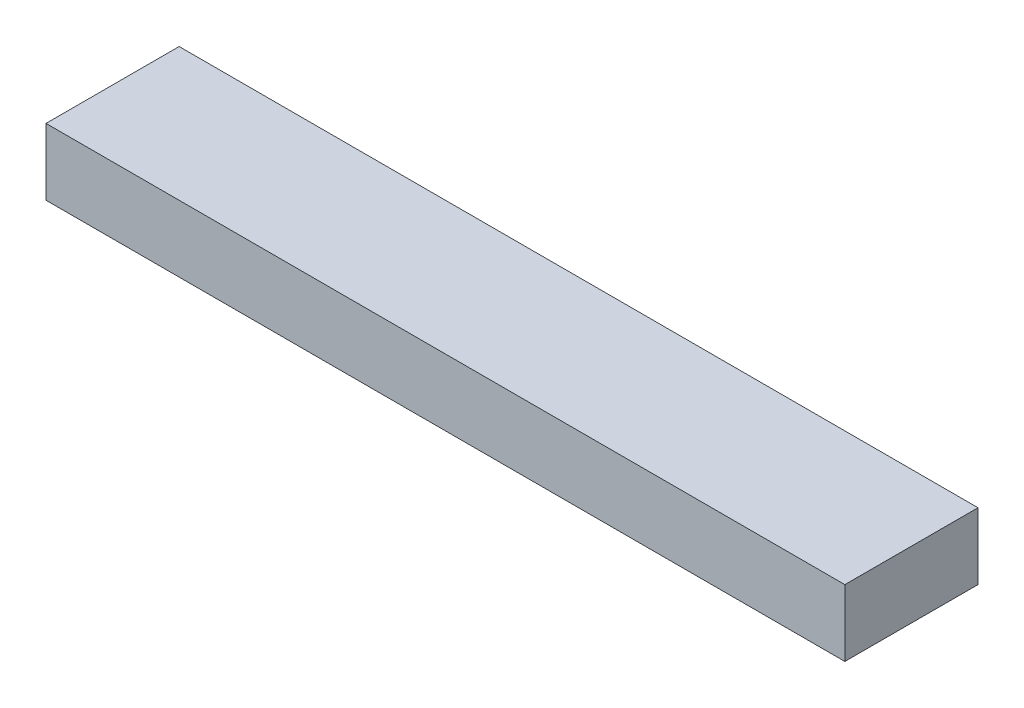
ISO-10303-21;
HEADER;
FILE_DESCRIPTION(('STEP AP214'),'2;1');
FILE_NAME('part.step','',(''),(''),'','','');
FILE_SCHEMA(('AUTOMOTIVE_DESIGN { 1 0 10303 214 1 1 1 1 }'));
ENDSEC;
DATA;
#1=APPLICATION_CONTEXT('core data for automotive mechanical design processes');
#2=APPLICATION_PROTOCOL_DEFINITION('international standard','automotive_design',2000,#1);
#3=PRODUCT_CONTEXT('',#1,'mechanical');
#4=PRODUCT('Part','Part','',(#3));
#5=PRODUCT_RELATED_PRODUCT_CATEGORY('part','',(#4));
#6=PRODUCT_DEFINITION_FORMATION('','',#4);
#7=PRODUCT_DEFINITION_CONTEXT('part definition',#1,'design');
#8=PRODUCT_DEFINITION('design','',#6,#7);
#9=PRODUCT_DEFINITION_SHAPE('','',#8);
#10=(LENGTH_UNIT() NAMED_UNIT(*) SI_UNIT(.MILLI.,.METRE.));
#11=(NAMED_UNIT(*) PLANE_ANGLE_UNIT() SI_UNIT($,.RADIAN.));
#12=(NAMED_UNIT(*) SI_UNIT($,.STERADIAN.) SOLID_ANGLE_UNIT());
#13=UNCERTAINTY_MEASURE_WITH_UNIT(LENGTH_MEASURE(1.E-05),#10,'distance_accuracy_value','');
#14=(GEOMETRIC_REPRESENTATION_CONTEXT(3) GLOBAL_UNCERTAINTY_ASSIGNED_CONTEXT((#13)) GLOBAL_UNIT_ASSIGNED_CONTEXT((#10,
#11,#12)) REPRESENTATION_CONTEXT('',''));
#15=CARTESIAN_POINT('',(0.,0.,0.));
#16=DIRECTION('',(0.,0.,1.));
#17=DIRECTION('',(1.,0.,0.));
#18=AXIS2_PLACEMENT_3D('',#15,#16,#17);
#19=CARTESIAN_POINT('',(0.,3.175,0.));
#20=DIRECTION('',(1.,0.,0.));
#21=DIRECTION('',(0.,0.,-1.));
#22=AXIS2_PLACEMENT_3D('',#19,#20,#21);
#23=PLANE('',#22);
#24=DIRECTION('',(0.,0.,1.));
#25=VECTOR('',#24,1.);
#26=CARTESIAN_POINT('',(0.,0.,0.));
#27=LINE('',#26,#25);
#28=CARTESIAN_POINT('',(0.,0.,-6.35));
#29=VERTEX_POINT('',#28);
#30=CARTESIAN_POINT('',(0.,0.,0.));
#31=VERTEX_POINT('',#30);
#32=EDGE_CURVE('E103',#29,#31,#27,.T.);
#33=ORIENTED_EDGE('',*,*,#32,.T.);
#34=DIRECTION('',(0.,-1.,0.));
#35=VECTOR('',#34,1.);
#36=CARTESIAN_POINT('',(0.,3.175,0.));
#37=LINE('',#36,#35);
#38=CARTESIAN_POINT('',(0.,3.175,0.));
#39=VERTEX_POINT('',#38);
#40=EDGE_CURVE('E11',#39,#31,#37,.T.);
#41=ORIENTED_EDGE('',*,*,#40,.F.);
#42=DIRECTION('',(0.,0.,1.));
#43=VECTOR('',#42,1.);
#44=CARTESIAN_POINT('',(0.,3.175,0.));
#45=LINE('',#44,#43);
#46=CARTESIAN_POINT('',(0.,3.175,-6.35));
#47=VERTEX_POINT('',#46);
#48=EDGE_CURVE('E91',#47,#39,#45,.T.);
#49=ORIENTED_EDGE('',*,*,#48,.F.);
#50=DIRECTION('',(0.,-1.,0.));
#51=VECTOR('',#50,1.);
#52=CARTESIAN_POINT('',(0.,3.175,-6.35));
#53=LINE('',#52,#51);
#54=EDGE_CURVE('E99',#47,#29,#53,.T.);
#55=ORIENTED_EDGE('',*,*,#54,.T.);
#56=EDGE_LOOP('',(#33,#41,#49,#55));
#57=FACE_BOUND('',#56,.T.);
#58=ADVANCED_FACE('F40',(#57),#23,.F.);
#59=CARTESIAN_POINT('',(0.,3.175,0.));
#60=DIRECTION('',(0.,0.,-1.));
#61=DIRECTION('',(-1.,0.,0.));
#62=AXIS2_PLACEMENT_3D('',#59,#60,#61);
#63=PLANE('',#62);
#64=DIRECTION('',(1.,0.,0.));
#65=VECTOR('',#64,1.);
#66=CARTESIAN_POINT('',(0.,0.,0.));
#67=LINE('',#66,#65);
#68=CARTESIAN_POINT('',(38.1,0.,0.));
#69=VERTEX_POINT('',#68);
#70=EDGE_CURVE('E95',#31,#69,#67,.T.);
#71=ORIENTED_EDGE('',*,*,#70,.T.);
#72=DIRECTION('',(0.,-1.,0.));
#73=VECTOR('',#72,1.);
#74=CARTESIAN_POINT('',(38.1,3.175,0.));
#75=LINE('',#74,#73);
#76=CARTESIAN_POINT('',(38.1,3.175,0.));
#77=VERTEX_POINT('',#76);
#78=EDGE_CURVE('E48',#77,#69,#75,.T.);
#79=ORIENTED_EDGE('',*,*,#78,.F.);
#80=DIRECTION('',(1.,0.,0.));
#81=VECTOR('',#80,1.);
#82=CARTESIAN_POINT('',(0.,3.175,0.));
#83=LINE('',#82,#81);
#84=EDGE_CURVE('E86',#39,#77,#83,.T.);
#85=ORIENTED_EDGE('',*,*,#84,.F.);
#86=ORIENTED_EDGE('',*,*,#40,.T.);
#87=EDGE_LOOP('',(#71,#79,#85,#86));
#88=FACE_BOUND('',#87,.T.);
#89=ADVANCED_FACE('F94',(#88),#63,.F.);
#90=CARTESIAN_POINT('',(38.1,3.175,0.));
#91=DIRECTION('',(-1.,0.,0.));
#92=DIRECTION('',(0.,0.,1.));
#93=AXIS2_PLACEMENT_3D('',#90,#91,#92);
#94=PLANE('',#93);
#95=DIRECTION('',(0.,0.,-1.));
#96=VECTOR('',#95,1.);
#97=CARTESIAN_POINT('',(38.1,0.,0.));
#98=LINE('',#97,#96);
#99=CARTESIAN_POINT('',(38.1,0.,-6.35));
#100=VERTEX_POINT('',#99);
#101=EDGE_CURVE('E73',#69,#100,#98,.T.);
#102=ORIENTED_EDGE('',*,*,#101,.T.);
#103=DIRECTION('',(0.,-1.,0.));
#104=VECTOR('',#103,1.);
#105=CARTESIAN_POINT('',(38.1,3.175,-6.35));
#106=LINE('',#105,#104);
#107=CARTESIAN_POINT('',(38.1,3.175,-6.35));
#108=VERTEX_POINT('',#107);
#109=EDGE_CURVE('E96',#108,#100,#106,.T.);
#110=ORIENTED_EDGE('',*,*,#109,.F.);
#111=DIRECTION('',(0.,0.,-1.));
#112=VECTOR('',#111,1.);
#113=CARTESIAN_POINT('',(38.1,3.175,0.));
#114=LINE('',#113,#112);
#115=EDGE_CURVE('E89',#77,#108,#114,.T.);
#116=ORIENTED_EDGE('',*,*,#115,.F.);
#117=ORIENTED_EDGE('',*,*,#78,.T.);
#118=EDGE_LOOP('',(#102,#110,#116,#117));
#119=FACE_BOUND('',#118,.T.);
#120=ADVANCED_FACE('F97',(#119),#94,.F.);
#121=CARTESIAN_POINT('',(0.,3.175,-6.35));
#122=DIRECTION('',(0.,0.,1.));
#123=DIRECTION('',(1.,0.,0.));
#124=AXIS2_PLACEMENT_3D('',#121,#122,#123);
#125=PLANE('',#124);
#126=DIRECTION('',(-1.,0.,0.));
#127=VECTOR('',#126,1.);
#128=CARTESIAN_POINT('',(0.,0.,-6.35));
#129=LINE('',#128,#127);
#130=EDGE_CURVE('E79',#100,#29,#129,.T.);
#131=ORIENTED_EDGE('',*,*,#130,.T.);
#132=ORIENTED_EDGE('',*,*,#54,.F.);
#133=DIRECTION('',(-1.,0.,0.));
#134=VECTOR('',#133,1.);
#135=CARTESIAN_POINT('',(0.,3.175,-6.35));
#136=LINE('',#135,#134);
#137=EDGE_CURVE('E56',#108,#47,#136,.T.);
#138=ORIENTED_EDGE('',*,*,#137,.F.);
#139=ORIENTED_EDGE('',*,*,#109,.T.);
#140=EDGE_LOOP('',(#131,#132,#138,#139));
#141=FACE_BOUND('',#140,.T.);
#142=ADVANCED_FACE('F110',(#141),#125,.F.);
#143=CARTESIAN_POINT('',(0.,3.175,0.));
#144=DIRECTION('',(0.,-1.,0.));
#145=DIRECTION('',(0.,0.,-1.));
#146=AXIS2_PLACEMENT_3D('',#143,#144,#145);
#147=PLANE('',#146);
#148=ORIENTED_EDGE('',*,*,#48,.T.);
#149=ORIENTED_EDGE('',*,*,#84,.T.);
#150=ORIENTED_EDGE('',*,*,#115,.T.);
#151=ORIENTED_EDGE('',*,*,#137,.T.);
#152=EDGE_LOOP('',(#148,#149,#150,#151));
#153=FACE_BOUND('',#152,.T.);
#154=ADVANCED_FACE('F87',(#153),#147,.F.);
#155=CARTESIAN_POINT('',(0.,0.,0.));
#156=DIRECTION('',(0.,-1.,0.));
#157=DIRECTION('',(0.,0.,-1.));
#158=AXIS2_PLACEMENT_3D('',#155,#156,#157);
#159=PLANE('',#158);
#160=ORIENTED_EDGE('',*,*,#32,.F.);
#161=ORIENTED_EDGE('',*,*,#130,.F.);
#162=ORIENTED_EDGE('',*,*,#101,.F.);
#163=ORIENTED_EDGE('',*,*,#70,.F.);
#164=EDGE_LOOP('',(#160,#161,#162,#163));
#165=FACE_BOUND('',#164,.T.);
#166=ADVANCED_FACE('F113',(#165),#159,.T.);
#167=CLOSED_SHELL('',(#58,#89,#120,#142,#154,#166));
#168=MANIFOLD_SOLID_BREP('B2',#167);
#169=ADVANCED_BREP_SHAPE_REPRESENTATION('',(#18,#168),#14);
#170=SHAPE_DEFINITION_REPRESENTATION(#9,#169);
ENDSEC;
END-ISO-10303-21;
